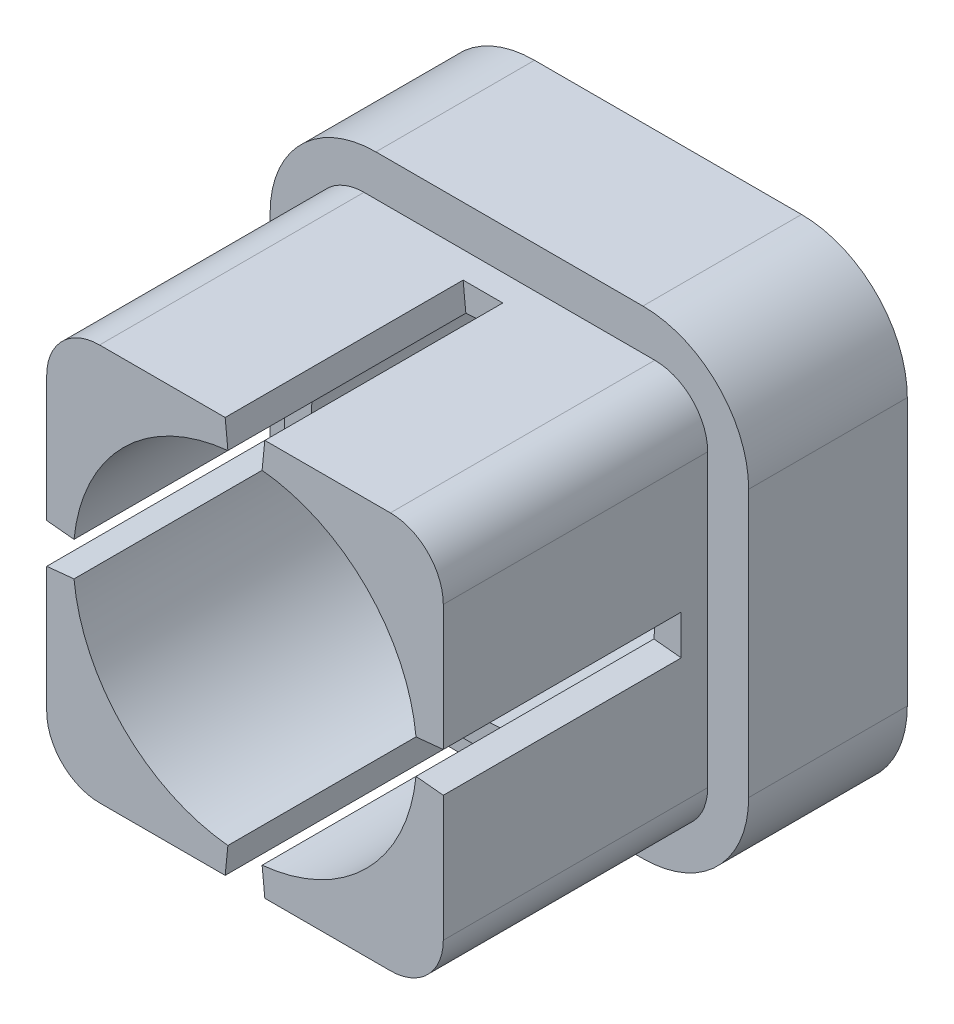
ISO-10303-21;
HEADER;
FILE_DESCRIPTION(('STEP AP214'),'2;1');
FILE_NAME('part.step','',(''),(''),'','','');
FILE_SCHEMA(('AUTOMOTIVE_DESIGN { 1 0 10303 214 1 1 1 1 }'));
ENDSEC;
DATA;
#1=APPLICATION_CONTEXT('core data for automotive mechanical design processes');
#2=APPLICATION_PROTOCOL_DEFINITION('international standard','automotive_design',2000,#1);
#3=PRODUCT_CONTEXT('',#1,'mechanical');
#4=PRODUCT('Part','Part','',(#3));
#5=PRODUCT_RELATED_PRODUCT_CATEGORY('part','',(#4));
#6=PRODUCT_DEFINITION_FORMATION('','',#4);
#7=PRODUCT_DEFINITION_CONTEXT('part definition',#1,'design');
#8=PRODUCT_DEFINITION('design','',#6,#7);
#9=PRODUCT_DEFINITION_SHAPE('','',#8);
#10=(LENGTH_UNIT() NAMED_UNIT(*) SI_UNIT(.MILLI.,.METRE.));
#11=(NAMED_UNIT(*) PLANE_ANGLE_UNIT() SI_UNIT($,.RADIAN.));
#12=(NAMED_UNIT(*) SI_UNIT($,.STERADIAN.) SOLID_ANGLE_UNIT());
#13=UNCERTAINTY_MEASURE_WITH_UNIT(LENGTH_MEASURE(1.E-05),#10,'distance_accuracy_value','');
#14=(GEOMETRIC_REPRESENTATION_CONTEXT(3) GLOBAL_UNCERTAINTY_ASSIGNED_CONTEXT((#13)) GLOBAL_UNIT_ASSIGNED_CONTEXT((#10,
#11,#12)) REPRESENTATION_CONTEXT('',''));
#15=CARTESIAN_POINT('',(0.,0.,0.));
#16=DIRECTION('',(0.,0.,1.));
#17=DIRECTION('',(1.,0.,0.));
#18=AXIS2_PLACEMENT_3D('',#15,#16,#17);
#19=CARTESIAN_POINT('',(-5.5,-5.5,16.));
#20=DIRECTION('',(0.,0.,-1.));
#21=DIRECTION('',(-1.,0.,0.));
#22=AXIS2_PLACEMENT_3D('',#19,#20,#21);
#23=PLANE('',#22);
#24=DIRECTION('',(1.,0.,0.));
#25=VECTOR('',#24,1.);
#26=CARTESIAN_POINT('',(-5.5,-7.5,16.));
#27=LINE('',#26,#25);
#28=CARTESIAN_POINT('',(-5.5,-7.5,16.));
#29=VERTEX_POINT('',#28);
#30=CARTESIAN_POINT('',(-0.749999999999921,-7.50000000000001,16.));
#31=VERTEX_POINT('',#30);
#32=EDGE_CURVE('E362',#29,#31,#27,.T.);
#33=ORIENTED_EDGE('',*,*,#32,.T.);
#34=DIRECTION('',(-0.0995037190209885,-0.99503719020999,0.));
#35=VECTOR('',#34,1.);
#36=CARTESIAN_POINT('',(0.,0.,16.));
#37=LINE('',#36,#35);
#38=CARTESIAN_POINT('',(-0.646774173636425,-6.46774173636494,16.));
#39=VERTEX_POINT('',#38);
#40=EDGE_CURVE('E262',#39,#31,#37,.T.);
#41=ORIENTED_EDGE('',*,*,#40,.F.);
#42=CARTESIAN_POINT('',(0.,0.,16.));
#43=DIRECTION('',(0.,0.,1.));
#44=DIRECTION('',(1.,0.,0.));
#45=AXIS2_PLACEMENT_3D('',#42,#43,#44);
#46=CIRCLE('',#45,6.5);
#47=CARTESIAN_POINT('',(-6.46774173636493,-0.646774173636493,16.));
#48=VERTEX_POINT('',#47);
#49=EDGE_CURVE('E576',#48,#39,#46,.T.);
#50=ORIENTED_EDGE('',*,*,#49,.F.);
#51=DIRECTION('',(0.995037190209989,0.0995037190209989,0.));
#52=VECTOR('',#51,1.);
#53=CARTESIAN_POINT('',(0.,0.,16.));
#54=LINE('',#53,#52);
#55=CARTESIAN_POINT('',(-7.5,-0.75,16.));
#56=VERTEX_POINT('',#55);
#57=EDGE_CURVE('E289',#56,#48,#54,.T.);
#58=ORIENTED_EDGE('',*,*,#57,.F.);
#59=DIRECTION('',(0.,-1.,0.));
#60=VECTOR('',#59,1.);
#61=CARTESIAN_POINT('',(-7.5,-5.5,16.));
#62=LINE('',#61,#60);
#63=CARTESIAN_POINT('',(-7.5,-5.5,16.));
#64=VERTEX_POINT('',#63);
#65=EDGE_CURVE('E384',#56,#64,#62,.T.);
#66=ORIENTED_EDGE('',*,*,#65,.T.);
#67=CARTESIAN_POINT('',(-5.5,-5.5,16.));
#68=DIRECTION('',(0.,0.,1.));
#69=DIRECTION('',(-1.,0.,0.));
#70=AXIS2_PLACEMENT_3D('',#67,#68,#69);
#71=CIRCLE('',#70,2.);
#72=EDGE_CURVE('E356',#64,#29,#71,.T.);
#73=ORIENTED_EDGE('',*,*,#72,.T.);
#74=EDGE_LOOP('',(#33,#41,#50,#58,#66,#73));
#75=FACE_BOUND('',#74,.T.);
#76=ADVANCED_FACE('F39',(#75),#23,.F.);
#77=CARTESIAN_POINT('',(-7.5,5.5,16.));
#78=VERTEX_POINT('',#77);
#79=CARTESIAN_POINT('',(-7.5,0.75,16.));
#80=VERTEX_POINT('',#79);
#81=EDGE_CURVE('E385',#78,#80,#62,.T.);
#82=ORIENTED_EDGE('',*,*,#81,.T.);
#83=DIRECTION('',(-0.995037190209989,0.0995037190209989,0.));
#84=VECTOR('',#83,1.);
#85=CARTESIAN_POINT('',(0.,0.,16.));
#86=LINE('',#85,#84);
#87=CARTESIAN_POINT('',(-6.46774173636493,0.646774173636493,16.));
#88=VERTEX_POINT('',#87);
#89=EDGE_CURVE('E283',#88,#80,#86,.T.);
#90=ORIENTED_EDGE('',*,*,#89,.F.);
#91=CARTESIAN_POINT('',(-0.646774173636516,6.46774173636493,16.));
#92=VERTEX_POINT('',#91);
#93=EDGE_CURVE('E355',#92,#88,#46,.T.);
#94=ORIENTED_EDGE('',*,*,#93,.F.);
#95=DIRECTION('',(0.0995037190210024,-0.995037190209989,0.));
#96=VECTOR('',#95,1.);
#97=CARTESIAN_POINT('',(0.,0.,16.));
#98=LINE('',#97,#96);
#99=CARTESIAN_POINT('',(-0.750000000000026,7.5,16.));
#100=VERTEX_POINT('',#99);
#101=EDGE_CURVE('E310',#100,#92,#98,.T.);
#102=ORIENTED_EDGE('',*,*,#101,.F.);
#103=DIRECTION('',(-1.,0.,0.));
#104=VECTOR('',#103,1.);
#105=CARTESIAN_POINT('',(-5.5,7.5,16.));
#106=LINE('',#105,#104);
#107=CARTESIAN_POINT('',(-5.5,7.5,16.));
#108=VERTEX_POINT('',#107);
#109=EDGE_CURVE('E376',#100,#108,#106,.T.);
#110=ORIENTED_EDGE('',*,*,#109,.T.);
#111=CARTESIAN_POINT('',(-5.5,5.5,16.));
#112=DIRECTION('',(0.,0.,1.));
#113=DIRECTION('',(-1.,0.,0.));
#114=AXIS2_PLACEMENT_3D('',#111,#112,#113);
#115=CIRCLE('',#114,2.);
#116=EDGE_CURVE('E381',#108,#78,#115,.T.);
#117=ORIENTED_EDGE('',*,*,#116,.T.);
#118=EDGE_LOOP('',(#82,#90,#94,#102,#110,#117));
#119=FACE_BOUND('',#118,.T.);
#120=ADVANCED_FACE('F645',(#119),#23,.F.);
#121=CARTESIAN_POINT('',(5.5,7.5,16.));
#122=VERTEX_POINT('',#121);
#123=CARTESIAN_POINT('',(0.749999999999974,7.5,16.));
#124=VERTEX_POINT('',#123);
#125=EDGE_CURVE('E377',#122,#124,#106,.T.);
#126=ORIENTED_EDGE('',*,*,#125,.T.);
#127=DIRECTION('',(0.0995037190209954,0.995037190209989,0.));
#128=VECTOR('',#127,1.);
#129=CARTESIAN_POINT('',(0.,0.,16.));
#130=LINE('',#129,#128);
#131=CARTESIAN_POINT('',(0.64677417363647,6.46774173636493,16.));
#132=VERTEX_POINT('',#131);
#133=EDGE_CURVE('E302',#132,#124,#130,.T.);
#134=ORIENTED_EDGE('',*,*,#133,.F.);
#135=CARTESIAN_POINT('',(6.46774173636493,0.646774173636493,16.));
#136=VERTEX_POINT('',#135);
#137=EDGE_CURVE('E350',#136,#132,#46,.T.);
#138=ORIENTED_EDGE('',*,*,#137,.F.);
#139=DIRECTION('',(-0.995037190209989,-0.0995037190209989,0.));
#140=VECTOR('',#139,1.);
#141=CARTESIAN_POINT('',(0.,0.,16.));
#142=LINE('',#141,#140);
#143=CARTESIAN_POINT('',(7.5,0.75,16.));
#144=VERTEX_POINT('',#143);
#145=EDGE_CURVE('E332',#144,#136,#142,.T.);
#146=ORIENTED_EDGE('',*,*,#145,.F.);
#147=DIRECTION('',(0.,1.,0.));
#148=VECTOR('',#147,1.);
#149=CARTESIAN_POINT('',(7.5,-5.5,16.));
#150=LINE('',#149,#148);
#151=CARTESIAN_POINT('',(7.5,5.5,16.));
#152=VERTEX_POINT('',#151);
#153=EDGE_CURVE('E368',#144,#152,#150,.T.);
#154=ORIENTED_EDGE('',*,*,#153,.T.);
#155=CARTESIAN_POINT('',(5.5,5.5,16.));
#156=DIRECTION('',(0.,0.,1.));
#157=DIRECTION('',(-1.,0.,0.));
#158=AXIS2_PLACEMENT_3D('',#155,#156,#157);
#159=CIRCLE('',#158,2.);
#160=EDGE_CURVE('E373',#152,#122,#159,.T.);
#161=ORIENTED_EDGE('',*,*,#160,.T.);
#162=EDGE_LOOP('',(#126,#134,#138,#146,#154,#161));
#163=FACE_BOUND('',#162,.T.);
#164=ADVANCED_FACE('F634',(#163),#23,.F.);
#165=CARTESIAN_POINT('',(5.05,5.05,6.));
#166=DIRECTION('',(0.,0.,-1.));
#167=DIRECTION('',(-1.,0.,0.));
#168=AXIS2_PLACEMENT_3D('',#165,#166,#167);
#169=CYLINDRICAL_SURFACE('',#168,4.00000000000001);
#170=CARTESIAN_POINT('',(5.05,5.05,0.));
#171=DIRECTION('',(0.,0.,1.));
#172=DIRECTION('',(-1.,0.,0.));
#173=AXIS2_PLACEMENT_3D('',#170,#171,#172);
#174=CIRCLE('',#173,4.00000000000001);
#175=CARTESIAN_POINT('',(9.05,5.05,0.));
#176=VERTEX_POINT('',#175);
#177=CARTESIAN_POINT('',(5.05,9.05,0.));
#178=VERTEX_POINT('',#177);
#179=EDGE_CURVE('E451',#176,#178,#174,.T.);
#180=ORIENTED_EDGE('',*,*,#179,.T.);
#181=DIRECTION('',(0.,0.,-1.));
#182=VECTOR('',#181,1.);
#183=CARTESIAN_POINT('',(5.05,9.05,6.));
#184=LINE('',#183,#182);
#185=CARTESIAN_POINT('',(5.05,9.05,6.));
#186=VERTEX_POINT('',#185);
#187=EDGE_CURVE('E529',#186,#178,#184,.T.);
#188=ORIENTED_EDGE('',*,*,#187,.F.);
#189=CARTESIAN_POINT('',(5.05,5.05,6.));
#190=DIRECTION('',(0.,0.,1.));
#191=DIRECTION('',(-1.,0.,0.));
#192=AXIS2_PLACEMENT_3D('',#189,#190,#191);
#193=CIRCLE('',#192,4.00000000000001);
#194=CARTESIAN_POINT('',(9.05,5.05,6.));
#195=VERTEX_POINT('',#194);
#196=EDGE_CURVE('E452',#195,#186,#193,.T.);
#197=ORIENTED_EDGE('',*,*,#196,.F.);
#198=DIRECTION('',(0.,0.,-1.));
#199=VECTOR('',#198,1.);
#200=CARTESIAN_POINT('',(9.05,5.05,6.));
#201=LINE('',#200,#199);
#202=EDGE_CURVE('E478',#195,#176,#201,.T.);
#203=ORIENTED_EDGE('',*,*,#202,.T.);
#204=EDGE_LOOP('',(#180,#188,#197,#203));
#205=FACE_BOUND('',#204,.T.);
#206=ADVANCED_FACE('F41',(#205),#169,.T.);
#207=CARTESIAN_POINT('',(-5.05,9.05,6.));
#208=DIRECTION('',(0.,-1.,0.));
#209=DIRECTION('',(0.,0.,-1.));
#210=AXIS2_PLACEMENT_3D('',#207,#208,#209);
#211=PLANE('',#210);
#212=DIRECTION('',(-1.,0.,0.));
#213=VECTOR('',#212,1.);
#214=CARTESIAN_POINT('',(-5.05,9.05,0.));
#215=LINE('',#214,#213);
#216=CARTESIAN_POINT('',(-5.05,9.05,0.));
#217=VERTEX_POINT('',#216);
#218=EDGE_CURVE('E482',#178,#217,#215,.T.);
#219=ORIENTED_EDGE('',*,*,#218,.T.);
#220=DIRECTION('',(0.,0.,-1.));
#221=VECTOR('',#220,1.);
#222=CARTESIAN_POINT('',(-5.05,9.05,6.));
#223=LINE('',#222,#221);
#224=CARTESIAN_POINT('',(-5.05,9.05,6.));
#225=VERTEX_POINT('',#224);
#226=EDGE_CURVE('E525',#225,#217,#223,.T.);
#227=ORIENTED_EDGE('',*,*,#226,.F.);
#228=DIRECTION('',(-1.,0.,0.));
#229=VECTOR('',#228,1.);
#230=CARTESIAN_POINT('',(-5.05,9.05,6.));
#231=LINE('',#230,#229);
#232=EDGE_CURVE('E456',#186,#225,#231,.T.);
#233=ORIENTED_EDGE('',*,*,#232,.F.);
#234=ORIENTED_EDGE('',*,*,#187,.T.);
#235=EDGE_LOOP('',(#219,#227,#233,#234));
#236=FACE_BOUND('',#235,.T.);
#237=ADVANCED_FACE('F652',(#236),#211,.F.);
#238=CARTESIAN_POINT('',(-5.04999999999999,5.04999999999999,6.));
#239=DIRECTION('',(0.,0.,-1.));
#240=DIRECTION('',(-1.,0.,0.));
#241=AXIS2_PLACEMENT_3D('',#238,#239,#240);
#242=CYLINDRICAL_SURFACE('',#241,4.00000000000002);
#243=CARTESIAN_POINT('',(-5.04999999999999,5.04999999999999,0.));
#244=DIRECTION('',(0.,0.,1.));
#245=DIRECTION('',(-1.,0.,0.));
#246=AXIS2_PLACEMENT_3D('',#243,#244,#245);
#247=CIRCLE('',#246,4.00000000000002);
#248=CARTESIAN_POINT('',(-9.05,5.05,0.));
#249=VERTEX_POINT('',#248);
#250=EDGE_CURVE('E485',#217,#249,#247,.T.);
#251=ORIENTED_EDGE('',*,*,#250,.T.);
#252=DIRECTION('',(0.,0.,-1.));
#253=VECTOR('',#252,1.);
#254=CARTESIAN_POINT('',(-9.05,5.05,6.));
#255=LINE('',#254,#253);
#256=CARTESIAN_POINT('',(-9.05,5.05,6.));
#257=VERTEX_POINT('',#256);
#258=EDGE_CURVE('E521',#257,#249,#255,.T.);
#259=ORIENTED_EDGE('',*,*,#258,.F.);
#260=CARTESIAN_POINT('',(-5.04999999999999,5.04999999999999,6.));
#261=DIRECTION('',(0.,0.,1.));
#262=DIRECTION('',(-1.,0.,0.));
#263=AXIS2_PLACEMENT_3D('',#260,#261,#262);
#264=CIRCLE('',#263,4.00000000000002);
#265=EDGE_CURVE('E460',#225,#257,#264,.T.);
#266=ORIENTED_EDGE('',*,*,#265,.F.);
#267=ORIENTED_EDGE('',*,*,#226,.T.);
#268=EDGE_LOOP('',(#251,#259,#266,#267));
#269=FACE_BOUND('',#268,.T.);
#270=ADVANCED_FACE('F745',(#269),#242,.T.);
#271=CARTESIAN_POINT('',(-9.05,-5.05,6.));
#272=DIRECTION('',(1.,0.,0.));
#273=DIRECTION('',(0.,0.,-1.));
#274=AXIS2_PLACEMENT_3D('',#271,#272,#273);
#275=PLANE('',#274);
#276=DIRECTION('',(0.,-1.,0.));
#277=VECTOR('',#276,1.);
#278=CARTESIAN_POINT('',(-9.05,-5.05,0.));
#279=LINE('',#278,#277);
#280=CARTESIAN_POINT('',(-9.05,-5.05,0.));
#281=VERTEX_POINT('',#280);
#282=EDGE_CURVE('E488',#249,#281,#279,.T.);
#283=ORIENTED_EDGE('',*,*,#282,.T.);
#284=DIRECTION('',(0.,0.,-1.));
#285=VECTOR('',#284,1.);
#286=CARTESIAN_POINT('',(-9.05,-5.05,6.));
#287=LINE('',#286,#285);
#288=CARTESIAN_POINT('',(-9.05,-5.05,6.));
#289=VERTEX_POINT('',#288);
#290=EDGE_CURVE('E517',#289,#281,#287,.T.);
#291=ORIENTED_EDGE('',*,*,#290,.F.);
#292=DIRECTION('',(0.,-1.,0.));
#293=VECTOR('',#292,1.);
#294=CARTESIAN_POINT('',(-9.05,-5.05,6.));
#295=LINE('',#294,#293);
#296=EDGE_CURVE('E463',#257,#289,#295,.T.);
#297=ORIENTED_EDGE('',*,*,#296,.F.);
#298=ORIENTED_EDGE('',*,*,#258,.T.);
#299=EDGE_LOOP('',(#283,#291,#297,#298));
#300=FACE_BOUND('',#299,.T.);
#301=ADVANCED_FACE('F741',(#300),#275,.F.);
#302=CARTESIAN_POINT('',(-5.04999999999999,-5.04999999999999,6.));
#303=DIRECTION('',(0.,0.,-1.));
#304=DIRECTION('',(-1.,0.,0.));
#305=AXIS2_PLACEMENT_3D('',#302,#303,#304);
#306=CYLINDRICAL_SURFACE('',#305,4.00000000000001);
#307=CARTESIAN_POINT('',(-5.04999999999999,-5.04999999999999,0.));
#308=DIRECTION('',(0.,0.,1.));
#309=DIRECTION('',(-1.,0.,0.));
#310=AXIS2_PLACEMENT_3D('',#307,#308,#309);
#311=CIRCLE('',#310,4.00000000000001);
#312=CARTESIAN_POINT('',(-5.05,-9.05,0.));
#313=VERTEX_POINT('',#312);
#314=EDGE_CURVE('E491',#281,#313,#311,.T.);
#315=ORIENTED_EDGE('',*,*,#314,.T.);
#316=DIRECTION('',(0.,0.,-1.));
#317=VECTOR('',#316,1.);
#318=CARTESIAN_POINT('',(-5.05,-9.05,6.));
#319=LINE('',#318,#317);
#320=CARTESIAN_POINT('',(-5.05,-9.05,6.));
#321=VERTEX_POINT('',#320);
#322=EDGE_CURVE('E513',#321,#313,#319,.T.);
#323=ORIENTED_EDGE('',*,*,#322,.F.);
#324=CARTESIAN_POINT('',(-5.04999999999999,-5.04999999999999,6.));
#325=DIRECTION('',(0.,0.,1.));
#326=DIRECTION('',(-1.,0.,0.));
#327=AXIS2_PLACEMENT_3D('',#324,#325,#326);
#328=CIRCLE('',#327,4.00000000000001);
#329=EDGE_CURVE('E466',#289,#321,#328,.T.);
#330=ORIENTED_EDGE('',*,*,#329,.F.);
#331=ORIENTED_EDGE('',*,*,#290,.T.);
#332=EDGE_LOOP('',(#315,#323,#330,#331));
#333=FACE_BOUND('',#332,.T.);
#334=ADVANCED_FACE('F737',(#333),#306,.T.);
#335=CARTESIAN_POINT('',(-5.05,-9.05,6.));
#336=DIRECTION('',(0.,1.,0.));
#337=DIRECTION('',(0.,0.,1.));
#338=AXIS2_PLACEMENT_3D('',#335,#336,#337);
#339=PLANE('',#338);
#340=DIRECTION('',(1.,0.,0.));
#341=VECTOR('',#340,1.);
#342=CARTESIAN_POINT('',(-5.05,-9.05,0.));
#343=LINE('',#342,#341);
#344=CARTESIAN_POINT('',(5.05,-9.05,0.));
#345=VERTEX_POINT('',#344);
#346=EDGE_CURVE('E494',#313,#345,#343,.T.);
#347=ORIENTED_EDGE('',*,*,#346,.T.);
#348=DIRECTION('',(0.,0.,-1.));
#349=VECTOR('',#348,1.);
#350=CARTESIAN_POINT('',(5.05,-9.05,6.));
#351=LINE('',#350,#349);
#352=CARTESIAN_POINT('',(5.05,-9.05,6.));
#353=VERTEX_POINT('',#352);
#354=EDGE_CURVE('E509',#353,#345,#351,.T.);
#355=ORIENTED_EDGE('',*,*,#354,.F.);
#356=DIRECTION('',(1.,0.,0.));
#357=VECTOR('',#356,1.);
#358=CARTESIAN_POINT('',(-5.05,-9.05,6.));
#359=LINE('',#358,#357);
#360=EDGE_CURVE('E469',#321,#353,#359,.T.);
#361=ORIENTED_EDGE('',*,*,#360,.F.);
#362=ORIENTED_EDGE('',*,*,#322,.T.);
#363=EDGE_LOOP('',(#347,#355,#361,#362));
#364=FACE_BOUND('',#363,.T.);
#365=ADVANCED_FACE('F733',(#364),#339,.F.);
#366=CARTESIAN_POINT('',(5.04999999999999,-5.04999999999999,6.));
#367=DIRECTION('',(0.,0.,-1.));
#368=DIRECTION('',(-1.,0.,0.));
#369=AXIS2_PLACEMENT_3D('',#366,#367,#368);
#370=CYLINDRICAL_SURFACE('',#369,4.00000000000001);
#371=CARTESIAN_POINT('',(5.04999999999999,-5.04999999999999,0.));
#372=DIRECTION('',(0.,0.,1.));
#373=DIRECTION('',(-1.,0.,0.));
#374=AXIS2_PLACEMENT_3D('',#371,#372,#373);
#375=CIRCLE('',#374,4.00000000000001);
#376=CARTESIAN_POINT('',(9.05,-5.05,0.));
#377=VERTEX_POINT('',#376);
#378=EDGE_CURVE('E497',#345,#377,#375,.T.);
#379=ORIENTED_EDGE('',*,*,#378,.T.);
#380=DIRECTION('',(0.,0.,-1.));
#381=VECTOR('',#380,1.);
#382=CARTESIAN_POINT('',(9.05,-5.05,6.));
#383=LINE('',#382,#381);
#384=CARTESIAN_POINT('',(9.05,-5.05,6.));
#385=VERTEX_POINT('',#384);
#386=EDGE_CURVE('E505',#385,#377,#383,.T.);
#387=ORIENTED_EDGE('',*,*,#386,.F.);
#388=CARTESIAN_POINT('',(5.04999999999999,-5.04999999999999,6.));
#389=DIRECTION('',(0.,0.,1.));
#390=DIRECTION('',(-1.,0.,0.));
#391=AXIS2_PLACEMENT_3D('',#388,#389,#390);
#392=CIRCLE('',#391,4.00000000000001);
#393=EDGE_CURVE('E472',#353,#385,#392,.T.);
#394=ORIENTED_EDGE('',*,*,#393,.F.);
#395=ORIENTED_EDGE('',*,*,#354,.T.);
#396=EDGE_LOOP('',(#379,#387,#394,#395));
#397=FACE_BOUND('',#396,.T.);
#398=ADVANCED_FACE('F729',(#397),#370,.T.);
#399=CARTESIAN_POINT('',(9.05,-5.05,6.));
#400=DIRECTION('',(-1.,0.,0.));
#401=DIRECTION('',(0.,0.,1.));
#402=AXIS2_PLACEMENT_3D('',#399,#400,#401);
#403=PLANE('',#402);
#404=DIRECTION('',(0.,1.,0.));
#405=VECTOR('',#404,1.);
#406=CARTESIAN_POINT('',(9.05,-5.05,0.));
#407=LINE('',#406,#405);
#408=EDGE_CURVE('E457',#377,#176,#407,.T.);
#409=ORIENTED_EDGE('',*,*,#408,.T.);
#410=ORIENTED_EDGE('',*,*,#202,.F.);
#411=DIRECTION('',(0.,1.,0.));
#412=VECTOR('',#411,1.);
#413=CARTESIAN_POINT('',(9.05,-5.05,6.));
#414=LINE('',#413,#412);
#415=EDGE_CURVE('E475',#385,#195,#414,.T.);
#416=ORIENTED_EDGE('',*,*,#415,.F.);
#417=ORIENTED_EDGE('',*,*,#386,.T.);
#418=EDGE_LOOP('',(#409,#410,#416,#417));
#419=FACE_BOUND('',#418,.T.);
#420=ADVANCED_FACE('F725',(#419),#403,.F.);
#421=CARTESIAN_POINT('',(5.05,5.05,6.));
#422=DIRECTION('',(0.,0.,-1.));
#423=DIRECTION('',(-1.,0.,0.));
#424=AXIS2_PLACEMENT_3D('',#421,#422,#423);
#425=PLANE('',#424);
#426=CARTESIAN_POINT('',(-5.5,-5.5,6.));
#427=DIRECTION('',(0.,0.,1.));
#428=DIRECTION('',(-1.,0.,0.));
#429=AXIS2_PLACEMENT_3D('',#426,#427,#428);
#430=CIRCLE('',#429,2.);
#431=CARTESIAN_POINT('',(-7.5,-5.5,6.));
#432=VERTEX_POINT('',#431);
#433=CARTESIAN_POINT('',(-5.5,-7.5,6.));
#434=VERTEX_POINT('',#433);
#435=EDGE_CURVE('E354',#432,#434,#430,.T.);
#436=ORIENTED_EDGE('',*,*,#435,.F.);
#437=DIRECTION('',(0.,-1.,0.));
#438=VECTOR('',#437,1.);
#439=CARTESIAN_POINT('',(-7.5,-5.5,6.));
#440=LINE('',#439,#438);
#441=CARTESIAN_POINT('',(-7.5,5.5,6.));
#442=VERTEX_POINT('',#441);
#443=EDGE_CURVE('E361',#442,#432,#440,.T.);
#444=ORIENTED_EDGE('',*,*,#443,.F.);
#445=CARTESIAN_POINT('',(-5.5,5.5,6.));
#446=DIRECTION('',(0.,0.,1.));
#447=DIRECTION('',(-1.,0.,0.));
#448=AXIS2_PLACEMENT_3D('',#445,#446,#447);
#449=CIRCLE('',#448,2.);
#450=CARTESIAN_POINT('',(-5.5,7.5,6.));
#451=VERTEX_POINT('',#450);
#452=EDGE_CURVE('E413',#451,#442,#449,.T.);
#453=ORIENTED_EDGE('',*,*,#452,.F.);
#454=DIRECTION('',(-1.,0.,0.));
#455=VECTOR('',#454,1.);
#456=CARTESIAN_POINT('',(-5.5,7.5,6.));
#457=LINE('',#456,#455);
#458=CARTESIAN_POINT('',(5.5,7.5,6.));
#459=VERTEX_POINT('',#458);
#460=EDGE_CURVE('E409',#459,#451,#457,.T.);
#461=ORIENTED_EDGE('',*,*,#460,.F.);
#462=CARTESIAN_POINT('',(5.5,5.5,6.));
#463=DIRECTION('',(0.,0.,1.));
#464=DIRECTION('',(-1.,0.,0.));
#465=AXIS2_PLACEMENT_3D('',#462,#463,#464);
#466=CIRCLE('',#465,2.);
#467=CARTESIAN_POINT('',(7.5,5.5,6.));
#468=VERTEX_POINT('',#467);
#469=EDGE_CURVE('E405',#468,#459,#466,.T.);
#470=ORIENTED_EDGE('',*,*,#469,.F.);
#471=DIRECTION('',(0.,1.,0.));
#472=VECTOR('',#471,1.);
#473=CARTESIAN_POINT('',(7.5,-5.5,6.));
#474=LINE('',#473,#472);
#475=CARTESIAN_POINT('',(7.5,-5.5,6.));
#476=VERTEX_POINT('',#475);
#477=EDGE_CURVE('E401',#476,#468,#474,.T.);
#478=ORIENTED_EDGE('',*,*,#477,.F.);
#479=CARTESIAN_POINT('',(5.5,-5.5,6.));
#480=DIRECTION('',(0.,0.,1.));
#481=DIRECTION('',(1.,0.,0.));
#482=AXIS2_PLACEMENT_3D('',#479,#480,#481);
#483=CIRCLE('',#482,2.);
#484=CARTESIAN_POINT('',(5.5,-7.5,6.));
#485=VERTEX_POINT('',#484);
#486=EDGE_CURVE('E397',#485,#476,#483,.T.);
#487=ORIENTED_EDGE('',*,*,#486,.F.);
#488=DIRECTION('',(1.,0.,0.));
#489=VECTOR('',#488,1.);
#490=CARTESIAN_POINT('',(-5.5,-7.5,6.));
#491=LINE('',#490,#489);
#492=EDGE_CURVE('E393',#434,#485,#491,.T.);
#493=ORIENTED_EDGE('',*,*,#492,.F.);
#494=EDGE_LOOP('',(#436,#444,#453,#461,#470,#478,#487,#493));
#495=FACE_BOUND('',#494,.T.);
#496=ORIENTED_EDGE('',*,*,#196,.T.);
#497=ORIENTED_EDGE('',*,*,#232,.T.);
#498=ORIENTED_EDGE('',*,*,#265,.T.);
#499=ORIENTED_EDGE('',*,*,#296,.T.);
#500=ORIENTED_EDGE('',*,*,#329,.T.);
#501=ORIENTED_EDGE('',*,*,#360,.T.);
#502=ORIENTED_EDGE('',*,*,#393,.T.);
#503=ORIENTED_EDGE('',*,*,#415,.T.);
#504=EDGE_LOOP('',(#496,#497,#498,#499,#500,#501,#502,#503));
#505=FACE_BOUND('',#504,.T.);
#506=ADVANCED_FACE('F586',(#495,#505),#425,.F.);
#507=CARTESIAN_POINT('',(5.05,5.05,0.));
#508=DIRECTION('',(0.,0.,-1.));
#509=DIRECTION('',(-1.,0.,0.));
#510=AXIS2_PLACEMENT_3D('',#507,#508,#509);
#511=PLANE('',#510);
#512=CARTESIAN_POINT('',(0.,0.,0.));
#513=DIRECTION('',(0.,0.,-1.));
#514=DIRECTION('',(-1.,0.,0.));
#515=AXIS2_PLACEMENT_3D('',#512,#513,#514);
#516=CIRCLE('',#515,6.5);
#517=CARTESIAN_POINT('',(-6.5,0.,0.));
#518=VERTEX_POINT('',#517);
#519=EDGE_CURVE('E279',#518,#518,#516,.T.);
#520=ORIENTED_EDGE('',*,*,#519,.F.);
#521=EDGE_LOOP('',(#520));
#522=FACE_BOUND('',#521,.T.);
#523=ORIENTED_EDGE('',*,*,#179,.F.);
#524=ORIENTED_EDGE('',*,*,#408,.F.);
#525=ORIENTED_EDGE('',*,*,#378,.F.);
#526=ORIENTED_EDGE('',*,*,#346,.F.);
#527=ORIENTED_EDGE('',*,*,#314,.F.);
#528=ORIENTED_EDGE('',*,*,#282,.F.);
#529=ORIENTED_EDGE('',*,*,#250,.F.);
#530=ORIENTED_EDGE('',*,*,#218,.F.);
#531=EDGE_LOOP('',(#523,#524,#525,#526,#527,#528,#529,#530));
#532=FACE_BOUND('',#531,.T.);
#533=ADVANCED_FACE('F632',(#522,#532),#511,.T.);
#534=CARTESIAN_POINT('',(0.646774173636561,-6.46774173636492,16.));
#535=VERTEX_POINT('',#534);
#536=CARTESIAN_POINT('',(6.46774173636493,-0.646774173636493,16.));
#537=VERTEX_POINT('',#536);
#538=EDGE_CURVE('E346',#535,#537,#46,.T.);
#539=ORIENTED_EDGE('',*,*,#538,.F.);
#540=DIRECTION('',(-0.0995037190210093,0.995037190209988,0.));
#541=VECTOR('',#540,1.);
#542=CARTESIAN_POINT('',(0.,0.,16.));
#543=LINE('',#542,#541);
#544=CARTESIAN_POINT('',(0.750000000000079,-7.49999999999999,16.));
#545=VERTEX_POINT('',#544);
#546=EDGE_CURVE('E256',#545,#535,#543,.T.);
#547=ORIENTED_EDGE('',*,*,#546,.F.);
#548=CARTESIAN_POINT('',(5.5,-7.5,16.));
#549=VERTEX_POINT('',#548);
#550=EDGE_CURVE('E360',#545,#549,#27,.T.);
#551=ORIENTED_EDGE('',*,*,#550,.T.);
#552=CARTESIAN_POINT('',(5.5,-5.5,16.));
#553=DIRECTION('',(0.,0.,1.));
#554=DIRECTION('',(1.,0.,0.));
#555=AXIS2_PLACEMENT_3D('',#552,#553,#554);
#556=CIRCLE('',#555,2.);
#557=CARTESIAN_POINT('',(7.5,-5.5,16.));
#558=VERTEX_POINT('',#557);
#559=EDGE_CURVE('E365',#549,#558,#556,.T.);
#560=ORIENTED_EDGE('',*,*,#559,.T.);
#561=CARTESIAN_POINT('',(7.5,-0.75,16.));
#562=VERTEX_POINT('',#561);
#563=EDGE_CURVE('E369',#558,#562,#150,.T.);
#564=ORIENTED_EDGE('',*,*,#563,.T.);
#565=DIRECTION('',(0.995037190209989,-0.0995037190209989,0.));
#566=VECTOR('',#565,1.);
#567=CARTESIAN_POINT('',(0.,0.,16.));
#568=LINE('',#567,#566);
#569=EDGE_CURVE('E324',#537,#562,#568,.T.);
#570=ORIENTED_EDGE('',*,*,#569,.F.);
#571=EDGE_LOOP('',(#539,#547,#551,#560,#564,#570));
#572=FACE_BOUND('',#571,.T.);
#573=ADVANCED_FACE('F630',(#572),#23,.F.);
#574=CARTESIAN_POINT('',(-5.5,-5.5,16.));
#575=DIRECTION('',(0.,0.,-1.));
#576=DIRECTION('',(-1.,0.,0.));
#577=AXIS2_PLACEMENT_3D('',#574,#575,#576);
#578=CYLINDRICAL_SURFACE('',#577,2.);
#579=ORIENTED_EDGE('',*,*,#435,.T.);
#580=DIRECTION('',(0.,0.,-1.));
#581=VECTOR('',#580,1.);
#582=CARTESIAN_POINT('',(-5.5,-7.5,16.));
#583=LINE('',#582,#581);
#584=EDGE_CURVE('E447',#29,#434,#583,.T.);
#585=ORIENTED_EDGE('',*,*,#584,.F.);
#586=ORIENTED_EDGE('',*,*,#72,.F.);
#587=DIRECTION('',(0.,0.,-1.));
#588=VECTOR('',#587,1.);
#589=CARTESIAN_POINT('',(-7.5,-5.5,16.));
#590=LINE('',#589,#588);
#591=EDGE_CURVE('E389',#64,#432,#590,.T.);
#592=ORIENTED_EDGE('',*,*,#591,.T.);
#593=EDGE_LOOP('',(#579,#585,#586,#592));
#594=FACE_BOUND('',#593,.T.);
#595=ADVANCED_FACE('F583',(#594),#578,.T.);
#596=CARTESIAN_POINT('',(-5.5,-7.5,16.));
#597=DIRECTION('',(0.,1.,0.));
#598=DIRECTION('',(-1.,0.,0.));
#599=AXIS2_PLACEMENT_3D('',#596,#597,#598);
#600=PLANE('',#599);
#601=DIRECTION('',(1.,0.,0.));
#602=VECTOR('',#601,1.);
#603=CARTESIAN_POINT('',(0.750000000000079,-7.49999999999999,7.));
#604=LINE('',#603,#602);
#605=CARTESIAN_POINT('',(-0.749999999999921,-7.50000000000001,7.));
#606=VERTEX_POINT('',#605);
#607=CARTESIAN_POINT('',(0.750000000000079,-7.49999999999999,7.));
#608=VERTEX_POINT('',#607);
#609=EDGE_CURVE('E250',#606,#608,#604,.T.);
#610=ORIENTED_EDGE('',*,*,#609,.F.);
#611=DIRECTION('',(0.,0.,1.));
#612=VECTOR('',#611,1.);
#613=CARTESIAN_POINT('',(-0.749999999999921,-7.50000000000001,7.));
#614=LINE('',#613,#612);
#615=EDGE_CURVE('E259',#606,#31,#614,.T.);
#616=ORIENTED_EDGE('',*,*,#615,.T.);
#617=ORIENTED_EDGE('',*,*,#32,.F.);
#618=ORIENTED_EDGE('',*,*,#584,.T.);
#619=ORIENTED_EDGE('',*,*,#492,.T.);
#620=DIRECTION('',(0.,0.,-1.));
#621=VECTOR('',#620,1.);
#622=CARTESIAN_POINT('',(5.5,-7.5,16.));
#623=LINE('',#622,#621);
#624=EDGE_CURVE('E443',#549,#485,#623,.T.);
#625=ORIENTED_EDGE('',*,*,#624,.F.);
#626=ORIENTED_EDGE('',*,*,#550,.F.);
#627=DIRECTION('',(0.,0.,1.));
#628=VECTOR('',#627,1.);
#629=CARTESIAN_POINT('',(0.750000000000079,-7.49999999999999,7.));
#630=LINE('',#629,#628);
#631=EDGE_CURVE('E266',#608,#545,#630,.T.);
#632=ORIENTED_EDGE('',*,*,#631,.F.);
#633=EDGE_LOOP('',(#610,#616,#617,#618,#619,#625,#626,#632));
#634=FACE_BOUND('',#633,.T.);
#635=ADVANCED_FACE('F269',(#634),#600,.F.);
#636=CARTESIAN_POINT('',(5.5,-5.5,16.));
#637=DIRECTION('',(0.,0.,-1.));
#638=DIRECTION('',(-1.,0.,0.));
#639=AXIS2_PLACEMENT_3D('',#636,#637,#638);
#640=CYLINDRICAL_SURFACE('',#639,2.);
#641=ORIENTED_EDGE('',*,*,#486,.T.);
#642=DIRECTION('',(0.,0.,-1.));
#643=VECTOR('',#642,1.);
#644=CARTESIAN_POINT('',(7.5,-5.5,16.));
#645=LINE('',#644,#643);
#646=EDGE_CURVE('E439',#558,#476,#645,.T.);
#647=ORIENTED_EDGE('',*,*,#646,.F.);
#648=ORIENTED_EDGE('',*,*,#559,.F.);
#649=ORIENTED_EDGE('',*,*,#624,.T.);
#650=EDGE_LOOP('',(#641,#647,#648,#649));
#651=FACE_BOUND('',#650,.T.);
#652=ADVANCED_FACE('F616',(#651),#640,.T.);
#653=CARTESIAN_POINT('',(7.5,-5.5,16.));
#654=DIRECTION('',(-1.,0.,0.));
#655=DIRECTION('',(0.,0.,1.));
#656=AXIS2_PLACEMENT_3D('',#653,#654,#655);
#657=PLANE('',#656);
#658=DIRECTION('',(0.,1.,0.));
#659=VECTOR('',#658,1.);
#660=CARTESIAN_POINT('',(7.5,0.75,7.));
#661=LINE('',#660,#659);
#662=CARTESIAN_POINT('',(7.5,-0.75,7.));
#663=VERTEX_POINT('',#662);
#664=CARTESIAN_POINT('',(7.5,0.75,7.));
#665=VERTEX_POINT('',#664);
#666=EDGE_CURVE('E331',#663,#665,#661,.T.);
#667=ORIENTED_EDGE('',*,*,#666,.F.);
#668=DIRECTION('',(0.,0.,1.));
#669=VECTOR('',#668,1.);
#670=CARTESIAN_POINT('',(7.5,-0.75,7.));
#671=LINE('',#670,#669);
#672=EDGE_CURVE('E338',#663,#562,#671,.T.);
#673=ORIENTED_EDGE('',*,*,#672,.T.);
#674=ORIENTED_EDGE('',*,*,#563,.F.);
#675=ORIENTED_EDGE('',*,*,#646,.T.);
#676=ORIENTED_EDGE('',*,*,#477,.T.);
#677=DIRECTION('',(0.,0.,-1.));
#678=VECTOR('',#677,1.);
#679=CARTESIAN_POINT('',(7.5,5.5,16.));
#680=LINE('',#679,#678);
#681=EDGE_CURVE('E435',#152,#468,#680,.T.);
#682=ORIENTED_EDGE('',*,*,#681,.F.);
#683=ORIENTED_EDGE('',*,*,#153,.F.);
#684=DIRECTION('',(0.,0.,1.));
#685=VECTOR('',#684,1.);
#686=CARTESIAN_POINT('',(7.5,0.75,7.));
#687=LINE('',#686,#685);
#688=EDGE_CURVE('E343',#665,#144,#687,.T.);
#689=ORIENTED_EDGE('',*,*,#688,.F.);
#690=EDGE_LOOP('',(#667,#673,#674,#675,#676,#682,#683,#689));
#691=FACE_BOUND('',#690,.T.);
#692=ADVANCED_FACE('F610',(#691),#657,.F.);
#693=CARTESIAN_POINT('',(5.5,5.5,16.));
#694=DIRECTION('',(0.,0.,-1.));
#695=DIRECTION('',(-1.,0.,0.));
#696=AXIS2_PLACEMENT_3D('',#693,#694,#695);
#697=CYLINDRICAL_SURFACE('',#696,2.);
#698=ORIENTED_EDGE('',*,*,#469,.T.);
#699=DIRECTION('',(0.,0.,-1.));
#700=VECTOR('',#699,1.);
#701=CARTESIAN_POINT('',(5.5,7.5,16.));
#702=LINE('',#701,#700);
#703=EDGE_CURVE('E431',#122,#459,#702,.T.);
#704=ORIENTED_EDGE('',*,*,#703,.F.);
#705=ORIENTED_EDGE('',*,*,#160,.F.);
#706=ORIENTED_EDGE('',*,*,#681,.T.);
#707=EDGE_LOOP('',(#698,#704,#705,#706));
#708=FACE_BOUND('',#707,.T.);
#709=ADVANCED_FACE('F606',(#708),#697,.T.);
#710=CARTESIAN_POINT('',(-5.5,7.5,16.));
#711=DIRECTION('',(0.,-1.,0.));
#712=DIRECTION('',(0.,0.,-1.));
#713=AXIS2_PLACEMENT_3D('',#710,#711,#712);
#714=PLANE('',#713);
#715=DIRECTION('',(-1.,0.,0.));
#716=VECTOR('',#715,1.);
#717=CARTESIAN_POINT('',(-0.750000000000026,7.5,7.));
#718=LINE('',#717,#716);
#719=CARTESIAN_POINT('',(0.749999999999974,7.5,7.));
#720=VERTEX_POINT('',#719);
#721=CARTESIAN_POINT('',(-0.750000000000026,7.5,7.));
#722=VERTEX_POINT('',#721);
#723=EDGE_CURVE('E309',#720,#722,#718,.T.);
#724=ORIENTED_EDGE('',*,*,#723,.F.);
#725=DIRECTION('',(0.,0.,1.));
#726=VECTOR('',#725,1.);
#727=CARTESIAN_POINT('',(0.749999999999974,7.5,7.));
#728=LINE('',#727,#726);
#729=EDGE_CURVE('E316',#720,#124,#728,.T.);
#730=ORIENTED_EDGE('',*,*,#729,.T.);
#731=ORIENTED_EDGE('',*,*,#125,.F.);
#732=ORIENTED_EDGE('',*,*,#703,.T.);
#733=ORIENTED_EDGE('',*,*,#460,.T.);
#734=DIRECTION('',(0.,0.,-1.));
#735=VECTOR('',#734,1.);
#736=CARTESIAN_POINT('',(-5.5,7.5,16.));
#737=LINE('',#736,#735);
#738=EDGE_CURVE('E427',#108,#451,#737,.T.);
#739=ORIENTED_EDGE('',*,*,#738,.F.);
#740=ORIENTED_EDGE('',*,*,#109,.F.);
#741=DIRECTION('',(0.,0.,1.));
#742=VECTOR('',#741,1.);
#743=CARTESIAN_POINT('',(-0.750000000000026,7.5,7.));
#744=LINE('',#743,#742);
#745=EDGE_CURVE('E321',#722,#100,#744,.T.);
#746=ORIENTED_EDGE('',*,*,#745,.F.);
#747=EDGE_LOOP('',(#724,#730,#731,#732,#733,#739,#740,#746));
#748=FACE_BOUND('',#747,.T.);
#749=ADVANCED_FACE('F600',(#748),#714,.F.);
#750=CARTESIAN_POINT('',(-5.5,5.5,16.));
#751=DIRECTION('',(0.,0.,-1.));
#752=DIRECTION('',(-1.,0.,0.));
#753=AXIS2_PLACEMENT_3D('',#750,#751,#752);
#754=CYLINDRICAL_SURFACE('',#753,2.);
#755=ORIENTED_EDGE('',*,*,#452,.T.);
#756=DIRECTION('',(0.,0.,-1.));
#757=VECTOR('',#756,1.);
#758=CARTESIAN_POINT('',(-7.5,5.5,16.));
#759=LINE('',#758,#757);
#760=EDGE_CURVE('E423',#78,#442,#759,.T.);
#761=ORIENTED_EDGE('',*,*,#760,.F.);
#762=ORIENTED_EDGE('',*,*,#116,.F.);
#763=ORIENTED_EDGE('',*,*,#738,.T.);
#764=EDGE_LOOP('',(#755,#761,#762,#763));
#765=FACE_BOUND('',#764,.T.);
#766=ADVANCED_FACE('F596',(#765),#754,.T.);
#767=CARTESIAN_POINT('',(-7.5,-5.5,16.));
#768=DIRECTION('',(1.,0.,0.));
#769=DIRECTION('',(0.,0.,-1.));
#770=AXIS2_PLACEMENT_3D('',#767,#768,#769);
#771=PLANE('',#770);
#772=DIRECTION('',(0.,-1.,0.));
#773=VECTOR('',#772,1.);
#774=CARTESIAN_POINT('',(-7.5,-0.75,7.));
#775=LINE('',#774,#773);
#776=CARTESIAN_POINT('',(-7.5,0.75,7.));
#777=VERTEX_POINT('',#776);
#778=CARTESIAN_POINT('',(-7.5,-0.75,7.));
#779=VERTEX_POINT('',#778);
#780=EDGE_CURVE('E288',#777,#779,#775,.T.);
#781=ORIENTED_EDGE('',*,*,#780,.F.);
#782=DIRECTION('',(0.,0.,1.));
#783=VECTOR('',#782,1.);
#784=CARTESIAN_POINT('',(-7.5,0.75,7.));
#785=LINE('',#784,#783);
#786=EDGE_CURVE('E294',#777,#80,#785,.T.);
#787=ORIENTED_EDGE('',*,*,#786,.T.);
#788=ORIENTED_EDGE('',*,*,#81,.F.);
#789=ORIENTED_EDGE('',*,*,#760,.T.);
#790=ORIENTED_EDGE('',*,*,#443,.T.);
#791=ORIENTED_EDGE('',*,*,#591,.F.);
#792=ORIENTED_EDGE('',*,*,#65,.F.);
#793=DIRECTION('',(0.,0.,1.));
#794=VECTOR('',#793,1.);
#795=CARTESIAN_POINT('',(-7.5,-0.75,7.));
#796=LINE('',#795,#794);
#797=EDGE_CURVE('E299',#779,#56,#796,.T.);
#798=ORIENTED_EDGE('',*,*,#797,.F.);
#799=EDGE_LOOP('',(#781,#787,#788,#789,#790,#791,#792,#798));
#800=FACE_BOUND('',#799,.T.);
#801=ADVANCED_FACE('F590',(#800),#771,.F.);
#802=CARTESIAN_POINT('',(0.,0.,16.));
#803=DIRECTION('',(0.,0.,-1.));
#804=DIRECTION('',(-1.,0.,0.));
#805=AXIS2_PLACEMENT_3D('',#802,#803,#804);
#806=CYLINDRICAL_SURFACE('',#805,6.5);
#807=DIRECTION('',(0.,0.,-1.));
#808=VECTOR('',#807,1.);
#809=CARTESIAN_POINT('',(-0.646774173636425,-6.46774173636494,16.));
#810=LINE('',#809,#808);
#811=CARTESIAN_POINT('',(-0.646774173636425,-6.46774173636494,7.));
#812=VERTEX_POINT('',#811);
#813=EDGE_CURVE('E11',#812,#39,#810,.F.);
#814=ORIENTED_EDGE('',*,*,#813,.F.);
#815=CARTESIAN_POINT('',(0.,0.,7.));
#816=DIRECTION('',(0.,0.,-1.));
#817=DIRECTION('',(-1.,0.,0.));
#818=AXIS2_PLACEMENT_3D('',#815,#816,#817);
#819=CIRCLE('',#818,6.5);
#820=CARTESIAN_POINT('',(0.646774173636561,-6.46774173636492,7.));
#821=VERTEX_POINT('',#820);
#822=EDGE_CURVE('E252',#821,#812,#819,.T.);
#823=ORIENTED_EDGE('',*,*,#822,.F.);
#824=DIRECTION('',(0.,0.,-1.));
#825=VECTOR('',#824,1.);
#826=CARTESIAN_POINT('',(0.646774173636561,-6.46774173636492,16.));
#827=LINE('',#826,#825);
#828=EDGE_CURVE('E48',#535,#821,#827,.T.);
#829=ORIENTED_EDGE('',*,*,#828,.F.);
#830=ORIENTED_EDGE('',*,*,#538,.T.);
#831=DIRECTION('',(0.,0.,-1.));
#832=VECTOR('',#831,1.);
#833=CARTESIAN_POINT('',(6.46774173636493,-0.646774173636493,16.));
#834=LINE('',#833,#832);
#835=CARTESIAN_POINT('',(6.46774173636493,-0.646774173636493,7.));
#836=VERTEX_POINT('',#835);
#837=EDGE_CURVE('E540',#836,#537,#834,.F.);
#838=ORIENTED_EDGE('',*,*,#837,.F.);
#839=CARTESIAN_POINT('',(0.,0.,7.));
#840=DIRECTION('',(0.,0.,-1.));
#841=DIRECTION('',(-1.,0.,0.));
#842=AXIS2_PLACEMENT_3D('',#839,#840,#841);
#843=CIRCLE('',#842,6.5);
#844=CARTESIAN_POINT('',(6.46774173636493,0.646774173636493,7.));
#845=VERTEX_POINT('',#844);
#846=EDGE_CURVE('E533',#845,#836,#843,.T.);
#847=ORIENTED_EDGE('',*,*,#846,.F.);
#848=DIRECTION('',(0.,0.,-1.));
#849=VECTOR('',#848,1.);
#850=CARTESIAN_POINT('',(6.46774173636493,0.646774173636493,16.));
#851=LINE('',#850,#849);
#852=EDGE_CURVE('E536',#136,#845,#851,.T.);
#853=ORIENTED_EDGE('',*,*,#852,.F.);
#854=ORIENTED_EDGE('',*,*,#137,.T.);
#855=DIRECTION('',(0.,0.,-1.));
#856=VECTOR('',#855,1.);
#857=CARTESIAN_POINT('',(0.64677417363647,6.46774173636493,16.));
#858=LINE('',#857,#856);
#859=CARTESIAN_POINT('',(0.64677417363647,6.46774173636493,7.));
#860=VERTEX_POINT('',#859);
#861=EDGE_CURVE('E551',#860,#132,#858,.F.);
#862=ORIENTED_EDGE('',*,*,#861,.F.);
#863=CARTESIAN_POINT('',(0.,0.,7.));
#864=DIRECTION('',(0.,0.,-1.));
#865=DIRECTION('',(-1.,0.,0.));
#866=AXIS2_PLACEMENT_3D('',#863,#864,#865);
#867=CIRCLE('',#866,6.5);
#868=CARTESIAN_POINT('',(-0.646774173636516,6.46774173636493,7.));
#869=VERTEX_POINT('',#868);
#870=EDGE_CURVE('E544',#869,#860,#867,.T.);
#871=ORIENTED_EDGE('',*,*,#870,.F.);
#872=DIRECTION('',(0.,0.,-1.));
#873=VECTOR('',#872,1.);
#874=CARTESIAN_POINT('',(-0.646774173636516,6.46774173636493,16.));
#875=LINE('',#874,#873);
#876=EDGE_CURVE('E547',#92,#869,#875,.T.);
#877=ORIENTED_EDGE('',*,*,#876,.F.);
#878=ORIENTED_EDGE('',*,*,#93,.T.);
#879=DIRECTION('',(0.,0.,-1.));
#880=VECTOR('',#879,1.);
#881=CARTESIAN_POINT('',(-6.46774173636493,0.646774173636493,16.));
#882=LINE('',#881,#880);
#883=CARTESIAN_POINT('',(-6.46774173636493,0.646774173636493,7.));
#884=VERTEX_POINT('',#883);
#885=EDGE_CURVE('E560',#884,#88,#882,.F.);
#886=ORIENTED_EDGE('',*,*,#885,.F.);
#887=CARTESIAN_POINT('',(0.,0.,7.));
#888=DIRECTION('',(0.,0.,-1.));
#889=DIRECTION('',(-1.,0.,0.));
#890=AXIS2_PLACEMENT_3D('',#887,#888,#889);
#891=CIRCLE('',#890,6.5);
#892=CARTESIAN_POINT('',(-6.46774173636493,-0.646774173636493,7.));
#893=VERTEX_POINT('',#892);
#894=EDGE_CURVE('E554',#893,#884,#891,.T.);
#895=ORIENTED_EDGE('',*,*,#894,.F.);
#896=DIRECTION('',(0.,0.,-1.));
#897=VECTOR('',#896,1.);
#898=CARTESIAN_POINT('',(-6.46774173636493,-0.646774173636493,16.));
#899=LINE('',#898,#897);
#900=EDGE_CURVE('E557',#48,#893,#899,.T.);
#901=ORIENTED_EDGE('',*,*,#900,.F.);
#902=ORIENTED_EDGE('',*,*,#49,.T.);
#903=EDGE_LOOP('',(#814,#823,#829,#830,#838,#847,#853,#854,#862,#871,#877,#878,#886,#895,#901,#902));
#904=FACE_BOUND('',#903,.T.);
#905=ORIENTED_EDGE('',*,*,#519,.T.);
#906=EDGE_LOOP('',(#905));
#907=FACE_BOUND('',#906,.T.);
#908=ADVANCED_FACE('F571',(#904,#907),#806,.F.);
#909=CARTESIAN_POINT('',(0.,0.,7.));
#910=DIRECTION('',(-0.0995037190209989,-0.995037190209989,0.));
#911=DIRECTION('',(0.995037190209989,-0.0995037190209989,0.));
#912=AXIS2_PLACEMENT_3D('',#909,#910,#911);
#913=PLANE('',#912);
#914=ORIENTED_EDGE('',*,*,#837,.T.);
#915=ORIENTED_EDGE('',*,*,#569,.T.);
#916=ORIENTED_EDGE('',*,*,#672,.F.);
#917=DIRECTION('',(0.995037190209989,-0.0995037190209989,0.));
#918=VECTOR('',#917,1.);
#919=CARTESIAN_POINT('',(0.,0.,7.));
#920=LINE('',#919,#918);
#921=EDGE_CURVE('E328',#836,#663,#920,.T.);
#922=ORIENTED_EDGE('',*,*,#921,.F.);
#923=EDGE_LOOP('',(#914,#915,#916,#922));
#924=FACE_BOUND('',#923,.T.);
#925=ADVANCED_FACE('F628',(#924),#913,.F.);
#926=CARTESIAN_POINT('',(0.,0.,7.));
#927=DIRECTION('',(-0.0995037190209989,0.995037190209989,0.));
#928=DIRECTION('',(-0.995037190209989,-0.0995037190209989,0.));
#929=AXIS2_PLACEMENT_3D('',#926,#927,#928);
#930=PLANE('',#929);
#931=ORIENTED_EDGE('',*,*,#852,.T.);
#932=DIRECTION('',(-0.995037190209989,-0.0995037190209989,0.));
#933=VECTOR('',#932,1.);
#934=CARTESIAN_POINT('',(0.,0.,7.));
#935=LINE('',#934,#933);
#936=EDGE_CURVE('E335',#665,#845,#935,.T.);
#937=ORIENTED_EDGE('',*,*,#936,.F.);
#938=ORIENTED_EDGE('',*,*,#688,.T.);
#939=ORIENTED_EDGE('',*,*,#145,.T.);
#940=EDGE_LOOP('',(#931,#937,#938,#939));
#941=FACE_BOUND('',#940,.T.);
#942=ADVANCED_FACE('F691',(#941),#930,.F.);
#943=CARTESIAN_POINT('',(0.,0.,7.));
#944=DIRECTION('',(0.,0.,-1.));
#945=DIRECTION('',(-1.,0.,0.));
#946=AXIS2_PLACEMENT_3D('',#943,#944,#945);
#947=PLANE('',#946);
#948=ORIENTED_EDGE('',*,*,#846,.T.);
#949=ORIENTED_EDGE('',*,*,#921,.T.);
#950=ORIENTED_EDGE('',*,*,#666,.T.);
#951=ORIENTED_EDGE('',*,*,#936,.T.);
#952=EDGE_LOOP('',(#948,#949,#950,#951));
#953=FACE_BOUND('',#952,.T.);
#954=ADVANCED_FACE('F693',(#953),#947,.F.);
#955=CARTESIAN_POINT('',(0.,0.,7.));
#956=DIRECTION('',(0.995037190209989,-0.0995037190209954,0.));
#957=DIRECTION('',(0.0995037190209955,0.995037190209989,0.));
#958=AXIS2_PLACEMENT_3D('',#955,#956,#957);
#959=PLANE('',#958);
#960=ORIENTED_EDGE('',*,*,#861,.T.);
#961=ORIENTED_EDGE('',*,*,#133,.T.);
#962=ORIENTED_EDGE('',*,*,#729,.F.);
#963=DIRECTION('',(0.0995037190209954,0.995037190209989,0.));
#964=VECTOR('',#963,1.);
#965=CARTESIAN_POINT('',(0.,0.,7.));
#966=LINE('',#965,#964);
#967=EDGE_CURVE('E306',#860,#720,#966,.T.);
#968=ORIENTED_EDGE('',*,*,#967,.F.);
#969=EDGE_LOOP('',(#960,#961,#962,#968));
#970=FACE_BOUND('',#969,.T.);
#971=ADVANCED_FACE('F687',(#970),#959,.F.);
#972=CARTESIAN_POINT('',(0.,0.,7.));
#973=DIRECTION('',(-0.995037190209989,-0.0995037190210024,0.));
#974=DIRECTION('',(0.0995037190210024,-0.995037190209989,0.));
#975=AXIS2_PLACEMENT_3D('',#972,#973,#974);
#976=PLANE('',#975);
#977=ORIENTED_EDGE('',*,*,#876,.T.);
#978=DIRECTION('',(0.0995037190210024,-0.995037190209989,0.));
#979=VECTOR('',#978,1.);
#980=CARTESIAN_POINT('',(0.,0.,7.));
#981=LINE('',#980,#979);
#982=EDGE_CURVE('E313',#722,#869,#981,.T.);
#983=ORIENTED_EDGE('',*,*,#982,.F.);
#984=ORIENTED_EDGE('',*,*,#745,.T.);
#985=ORIENTED_EDGE('',*,*,#101,.T.);
#986=EDGE_LOOP('',(#977,#983,#984,#985));
#987=FACE_BOUND('',#986,.T.);
#988=ADVANCED_FACE('F678',(#987),#976,.F.);
#989=CARTESIAN_POINT('',(0.,0.,7.));
#990=DIRECTION('',(0.,0.,-1.));
#991=DIRECTION('',(0.,-1.,0.));
#992=AXIS2_PLACEMENT_3D('',#989,#990,#991);
#993=PLANE('',#992);
#994=ORIENTED_EDGE('',*,*,#870,.T.);
#995=ORIENTED_EDGE('',*,*,#967,.T.);
#996=ORIENTED_EDGE('',*,*,#723,.T.);
#997=ORIENTED_EDGE('',*,*,#982,.T.);
#998=EDGE_LOOP('',(#994,#995,#996,#997));
#999=FACE_BOUND('',#998,.T.);
#1000=ADVANCED_FACE('F682',(#999),#993,.F.);
#1001=CARTESIAN_POINT('',(0.,0.,7.));
#1002=DIRECTION('',(0.0995037190209989,0.995037190209989,0.));
#1003=DIRECTION('',(-0.995037190209989,0.0995037190209989,0.));
#1004=AXIS2_PLACEMENT_3D('',#1001,#1002,#1003);
#1005=PLANE('',#1004);
#1006=ORIENTED_EDGE('',*,*,#885,.T.);
#1007=ORIENTED_EDGE('',*,*,#89,.T.);
#1008=ORIENTED_EDGE('',*,*,#786,.F.);
#1009=DIRECTION('',(-0.995037190209989,0.0995037190209989,0.));
#1010=VECTOR('',#1009,1.);
#1011=CARTESIAN_POINT('',(0.,0.,7.));
#1012=LINE('',#1011,#1010);
#1013=EDGE_CURVE('E285',#884,#777,#1012,.T.);
#1014=ORIENTED_EDGE('',*,*,#1013,.F.);
#1015=EDGE_LOOP('',(#1006,#1007,#1008,#1014));
#1016=FACE_BOUND('',#1015,.T.);
#1017=ADVANCED_FACE('F671',(#1016),#1005,.F.);
#1018=CARTESIAN_POINT('',(0.,0.,7.));
#1019=DIRECTION('',(0.0995037190209989,-0.995037190209989,0.));
#1020=DIRECTION('',(0.995037190209989,0.0995037190209989,0.));
#1021=AXIS2_PLACEMENT_3D('',#1018,#1019,#1020);
#1022=PLANE('',#1021);
#1023=ORIENTED_EDGE('',*,*,#900,.T.);
#1024=DIRECTION('',(0.995037190209989,0.0995037190209989,0.));
#1025=VECTOR('',#1024,1.);
#1026=CARTESIAN_POINT('',(0.,0.,7.));
#1027=LINE('',#1026,#1025);
#1028=EDGE_CURVE('E63',#779,#893,#1027,.T.);
#1029=ORIENTED_EDGE('',*,*,#1028,.F.);
#1030=ORIENTED_EDGE('',*,*,#797,.T.);
#1031=ORIENTED_EDGE('',*,*,#57,.T.);
#1032=EDGE_LOOP('',(#1023,#1029,#1030,#1031));
#1033=FACE_BOUND('',#1032,.T.);
#1034=ADVANCED_FACE('F664',(#1033),#1022,.F.);
#1035=CARTESIAN_POINT('',(0.,0.,7.));
#1036=DIRECTION('',(0.,0.,-1.));
#1037=DIRECTION('',(1.,0.,0.));
#1038=AXIS2_PLACEMENT_3D('',#1035,#1036,#1037);
#1039=PLANE('',#1038);
#1040=ORIENTED_EDGE('',*,*,#894,.T.);
#1041=ORIENTED_EDGE('',*,*,#1013,.T.);
#1042=ORIENTED_EDGE('',*,*,#780,.T.);
#1043=ORIENTED_EDGE('',*,*,#1028,.T.);
#1044=EDGE_LOOP('',(#1040,#1041,#1042,#1043));
#1045=FACE_BOUND('',#1044,.T.);
#1046=ADVANCED_FACE('F668',(#1045),#1039,.F.);
#1047=CARTESIAN_POINT('',(0.,0.,7.));
#1048=DIRECTION('',(-0.99503719020999,0.0995037190209885,0.));
#1049=DIRECTION('',(-0.0995037190209885,-0.99503719020999,0.));
#1050=AXIS2_PLACEMENT_3D('',#1047,#1048,#1049);
#1051=PLANE('',#1050);
#1052=ORIENTED_EDGE('',*,*,#813,.T.);
#1053=ORIENTED_EDGE('',*,*,#40,.T.);
#1054=ORIENTED_EDGE('',*,*,#615,.F.);
#1055=DIRECTION('',(-0.0995037190209885,-0.99503719020999,0.));
#1056=VECTOR('',#1055,1.);
#1057=CARTESIAN_POINT('',(0.,0.,7.));
#1058=LINE('',#1057,#1056);
#1059=EDGE_CURVE('E246',#812,#606,#1058,.T.);
#1060=ORIENTED_EDGE('',*,*,#1059,.F.);
#1061=EDGE_LOOP('',(#1052,#1053,#1054,#1060));
#1062=FACE_BOUND('',#1061,.T.);
#1063=ADVANCED_FACE('F260',(#1062),#1051,.F.);
#1064=CARTESIAN_POINT('',(0.,0.,7.));
#1065=DIRECTION('',(0.995037190209988,0.0995037190210093,0.));
#1066=DIRECTION('',(-0.0995037190210094,0.995037190209988,0.));
#1067=AXIS2_PLACEMENT_3D('',#1064,#1065,#1066);
#1068=PLANE('',#1067);
#1069=ORIENTED_EDGE('',*,*,#828,.T.);
#1070=DIRECTION('',(-0.0995037190210093,0.995037190209988,0.));
#1071=VECTOR('',#1070,1.);
#1072=CARTESIAN_POINT('',(0.,0.,7.));
#1073=LINE('',#1072,#1071);
#1074=EDGE_CURVE('E55',#608,#821,#1073,.T.);
#1075=ORIENTED_EDGE('',*,*,#1074,.F.);
#1076=ORIENTED_EDGE('',*,*,#631,.T.);
#1077=ORIENTED_EDGE('',*,*,#546,.T.);
#1078=EDGE_LOOP('',(#1069,#1075,#1076,#1077));
#1079=FACE_BOUND('',#1078,.T.);
#1080=ADVANCED_FACE('F567',(#1079),#1068,.F.);
#1081=CARTESIAN_POINT('',(0.,0.,7.));
#1082=DIRECTION('',(0.,0.,-1.));
#1083=DIRECTION('',(0.,1.,0.));
#1084=AXIS2_PLACEMENT_3D('',#1081,#1082,#1083);
#1085=PLANE('',#1084);
#1086=ORIENTED_EDGE('',*,*,#822,.T.);
#1087=ORIENTED_EDGE('',*,*,#1059,.T.);
#1088=ORIENTED_EDGE('',*,*,#609,.T.);
#1089=ORIENTED_EDGE('',*,*,#1074,.T.);
#1090=EDGE_LOOP('',(#1086,#1087,#1088,#1089));
#1091=FACE_BOUND('',#1090,.T.);
#1092=ADVANCED_FACE('F248',(#1091),#1085,.F.);
#1093=CLOSED_SHELL('',(#76,#120,#164,#206,#237,#270,#301,#334,#365,#398,#420,#506,#533,#573,
#595,#635,#652,#692,#709,#749,#766,#801,#908,#925,#942,#954,#971,#988,#1000,#1017,#1034,#1046,
#1063,#1080,#1092));
#1094=MANIFOLD_SOLID_BREP('B2',#1093);
#1095=ADVANCED_BREP_SHAPE_REPRESENTATION('',(#18,#1094),#14);
#1096=SHAPE_DEFINITION_REPRESENTATION(#9,#1095);
ENDSEC;
END-ISO-10303-21;
